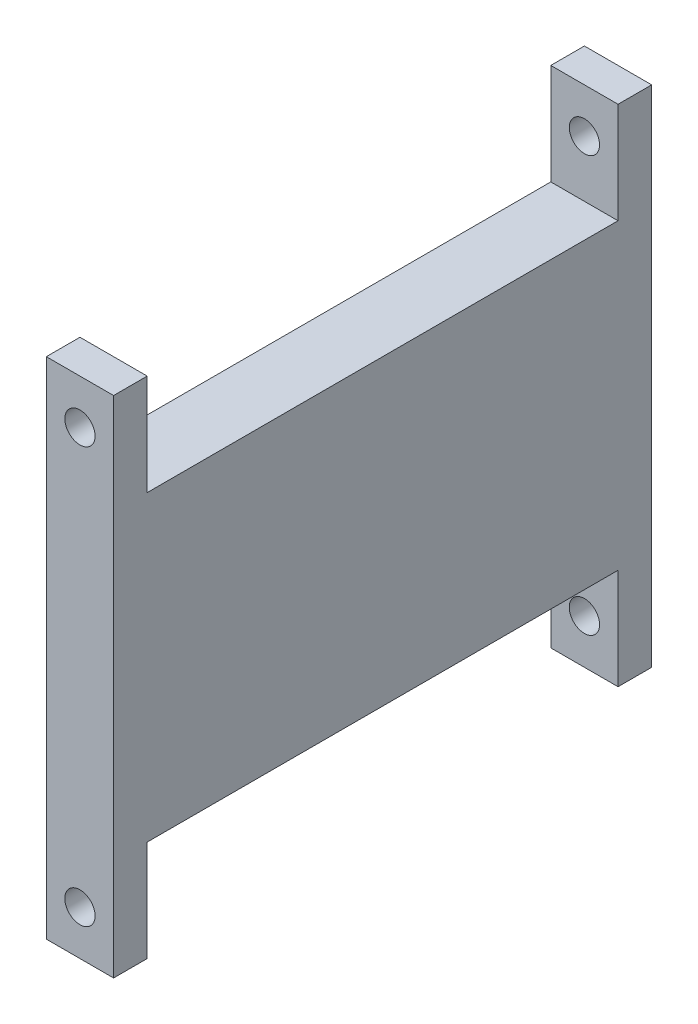
ISO-10303-21;
HEADER;
FILE_DESCRIPTION(('STEP AP214'),'2;1');
FILE_NAME('part.step','',(''),(''),'','','');
FILE_SCHEMA(('AUTOMOTIVE_DESIGN { 1 0 10303 214 1 1 1 1 }'));
ENDSEC;
DATA;
#1=APPLICATION_CONTEXT('core data for automotive mechanical design processes');
#2=APPLICATION_PROTOCOL_DEFINITION('international standard','automotive_design',2000,#1);
#3=PRODUCT_CONTEXT('',#1,'mechanical');
#4=PRODUCT('Part','Part','',(#3));
#5=PRODUCT_RELATED_PRODUCT_CATEGORY('part','',(#4));
#6=PRODUCT_DEFINITION_FORMATION('','',#4);
#7=PRODUCT_DEFINITION_CONTEXT('part definition',#1,'design');
#8=PRODUCT_DEFINITION('design','',#6,#7);
#9=PRODUCT_DEFINITION_SHAPE('','',#8);
#10=(LENGTH_UNIT() NAMED_UNIT(*) SI_UNIT(.MILLI.,.METRE.));
#11=(NAMED_UNIT(*) PLANE_ANGLE_UNIT() SI_UNIT($,.RADIAN.));
#12=(NAMED_UNIT(*) SI_UNIT($,.STERADIAN.) SOLID_ANGLE_UNIT());
#13=UNCERTAINTY_MEASURE_WITH_UNIT(LENGTH_MEASURE(1.E-05),#10,'distance_accuracy_value','');
#14=(GEOMETRIC_REPRESENTATION_CONTEXT(3) GLOBAL_UNCERTAINTY_ASSIGNED_CONTEXT((#13)) GLOBAL_UNIT_ASSIGNED_CONTEXT((#10,
#11,#12)) REPRESENTATION_CONTEXT('',''));
#15=CARTESIAN_POINT('',(0.,0.,0.));
#16=DIRECTION('',(0.,0.,1.));
#17=DIRECTION('',(1.,0.,0.));
#18=AXIS2_PLACEMENT_3D('',#15,#16,#17);
#19=CARTESIAN_POINT('',(-4.,30.,32.));
#20=DIRECTION('',(0.,-1.,0.));
#21=DIRECTION('',(0.,0.,-1.));
#22=AXIS2_PLACEMENT_3D('',#19,#20,#21);
#23=PLANE('',#22);
#24=DIRECTION('',(0.,0.,-1.));
#25=VECTOR('',#24,1.);
#26=CARTESIAN_POINT('',(-4.,30.,32.));
#27=LINE('',#26,#25);
#28=CARTESIAN_POINT('',(-4.,30.,-28.));
#29=VERTEX_POINT('',#28);
#30=CARTESIAN_POINT('',(-4.,30.,-32.));
#31=VERTEX_POINT('',#30);
#32=EDGE_CURVE('E275',#29,#31,#27,.T.);
#33=ORIENTED_EDGE('',*,*,#32,.F.);
#34=DIRECTION('',(-1.,0.,0.));
#35=VECTOR('',#34,1.);
#36=CARTESIAN_POINT('',(26.,30.,-28.));
#37=LINE('',#36,#35);
#38=CARTESIAN_POINT('',(4.,30.,-28.));
#39=VERTEX_POINT('',#38);
#40=EDGE_CURVE('E169',#39,#29,#37,.T.);
#41=ORIENTED_EDGE('',*,*,#40,.F.);
#42=DIRECTION('',(0.,0.,-1.));
#43=VECTOR('',#42,1.);
#44=CARTESIAN_POINT('',(4.,30.,32.));
#45=LINE('',#44,#43);
#46=CARTESIAN_POINT('',(4.,30.,-32.));
#47=VERTEX_POINT('',#46);
#48=EDGE_CURVE('E55',#39,#47,#45,.T.);
#49=ORIENTED_EDGE('',*,*,#48,.T.);
#50=DIRECTION('',(-1.,0.,0.));
#51=VECTOR('',#50,1.);
#52=CARTESIAN_POINT('',(-4.,30.,-32.));
#53=LINE('',#52,#51);
#54=EDGE_CURVE('E255',#47,#31,#53,.T.);
#55=ORIENTED_EDGE('',*,*,#54,.T.);
#56=EDGE_LOOP('',(#33,#41,#49,#55));
#57=FACE_BOUND('',#56,.T.);
#58=ADVANCED_FACE('F45',(#57),#23,.F.);
#59=CARTESIAN_POINT('',(-4.,-30.,32.));
#60=DIRECTION('',(0.,1.,0.));
#61=DIRECTION('',(0.,0.,1.));
#62=AXIS2_PLACEMENT_3D('',#59,#60,#61);
#63=PLANE('',#62);
#64=DIRECTION('',(0.,0.,-1.));
#65=VECTOR('',#64,1.);
#66=CARTESIAN_POINT('',(4.,-30.,32.));
#67=LINE('',#66,#65);
#68=CARTESIAN_POINT('',(4.,-30.,-28.));
#69=VERTEX_POINT('',#68);
#70=CARTESIAN_POINT('',(4.,-30.,-32.));
#71=VERTEX_POINT('',#70);
#72=EDGE_CURVE('E251',#69,#71,#67,.T.);
#73=ORIENTED_EDGE('',*,*,#72,.F.);
#74=DIRECTION('',(-1.,0.,0.));
#75=VECTOR('',#74,1.);
#76=CARTESIAN_POINT('',(26.,-30.,-28.));
#77=LINE('',#76,#75);
#78=CARTESIAN_POINT('',(-4.,-30.,-28.));
#79=VERTEX_POINT('',#78);
#80=EDGE_CURVE('E185',#69,#79,#77,.T.);
#81=ORIENTED_EDGE('',*,*,#80,.T.);
#82=DIRECTION('',(0.,0.,-1.));
#83=VECTOR('',#82,1.);
#84=CARTESIAN_POINT('',(-4.,-30.,32.));
#85=LINE('',#84,#83);
#86=CARTESIAN_POINT('',(-4.,-30.,-32.));
#87=VERTEX_POINT('',#86);
#88=EDGE_CURVE('E270',#79,#87,#85,.T.);
#89=ORIENTED_EDGE('',*,*,#88,.T.);
#90=DIRECTION('',(1.,0.,0.));
#91=VECTOR('',#90,1.);
#92=CARTESIAN_POINT('',(-4.,-30.,-32.));
#93=LINE('',#92,#91);
#94=EDGE_CURVE('E242',#87,#71,#93,.T.);
#95=ORIENTED_EDGE('',*,*,#94,.T.);
#96=EDGE_LOOP('',(#73,#81,#89,#95));
#97=FACE_BOUND('',#96,.T.);
#98=ADVANCED_FACE('F321',(#97),#63,.F.);
#99=CARTESIAN_POINT('',(0.,24.71,32.));
#100=DIRECTION('',(0.,0.,-1.));
#101=DIRECTION('',(-1.,0.,0.));
#102=AXIS2_PLACEMENT_3D('',#99,#100,#101);
#103=CYLINDRICAL_SURFACE('',#102,1.8);
#104=CARTESIAN_POINT('',(0.,24.71,-28.));
#105=DIRECTION('',(0.,0.,-1.));
#106=DIRECTION('',(-1.,0.,0.));
#107=AXIS2_PLACEMENT_3D('',#104,#105,#106);
#108=CIRCLE('',#107,1.8);
#109=CARTESIAN_POINT('',(-1.79999999999999,24.71,-28.));
#110=VERTEX_POINT('',#109);
#111=EDGE_CURVE('E49',#110,#110,#108,.T.);
#112=ORIENTED_EDGE('',*,*,#111,.F.);
#113=EDGE_LOOP('',(#112));
#114=FACE_BOUND('',#113,.T.);
#115=CARTESIAN_POINT('',(0.,24.71,-32.));
#116=DIRECTION('',(0.,0.,1.));
#117=DIRECTION('',(1.,0.,0.));
#118=AXIS2_PLACEMENT_3D('',#115,#116,#117);
#119=CIRCLE('',#118,1.8);
#120=CARTESIAN_POINT('',(1.80000000000001,24.71,-32.));
#121=VERTEX_POINT('',#120);
#122=EDGE_CURVE('E225',#121,#121,#119,.T.);
#123=ORIENTED_EDGE('',*,*,#122,.F.);
#124=EDGE_LOOP('',(#123));
#125=FACE_BOUND('',#124,.T.);
#126=ADVANCED_FACE('F294',(#114,#125),#103,.F.);
#127=CARTESIAN_POINT('',(0.,-24.71,32.));
#128=DIRECTION('',(0.,0.,-1.));
#129=DIRECTION('',(-1.,0.,0.));
#130=AXIS2_PLACEMENT_3D('',#127,#128,#129);
#131=CYLINDRICAL_SURFACE('',#130,1.8);
#132=CARTESIAN_POINT('',(0.,-24.71,-28.));
#133=DIRECTION('',(0.,0.,-1.));
#134=DIRECTION('',(-1.,0.,0.));
#135=AXIS2_PLACEMENT_3D('',#132,#133,#134);
#136=CIRCLE('',#135,1.8);
#137=CARTESIAN_POINT('',(-1.79999999999999,-24.71,-28.));
#138=VERTEX_POINT('',#137);
#139=EDGE_CURVE('E201',#138,#138,#136,.T.);
#140=ORIENTED_EDGE('',*,*,#139,.F.);
#141=EDGE_LOOP('',(#140));
#142=FACE_BOUND('',#141,.T.);
#143=CARTESIAN_POINT('',(0.,-24.71,-32.));
#144=DIRECTION('',(0.,0.,1.));
#145=DIRECTION('',(-1.,0.,0.));
#146=AXIS2_PLACEMENT_3D('',#143,#144,#145);
#147=CIRCLE('',#146,1.8);
#148=CARTESIAN_POINT('',(-1.79999999999999,-24.71,-32.));
#149=VERTEX_POINT('',#148);
#150=EDGE_CURVE('E220',#149,#149,#147,.T.);
#151=ORIENTED_EDGE('',*,*,#150,.F.);
#152=EDGE_LOOP('',(#151));
#153=FACE_BOUND('',#152,.T.);
#154=ADVANCED_FACE('F301',(#142,#153),#131,.F.);
#155=CARTESIAN_POINT('',(0.,0.,32.));
#156=DIRECTION('',(0.,0.,-1.));
#157=DIRECTION('',(-1.,0.,0.));
#158=AXIS2_PLACEMENT_3D('',#155,#156,#157);
#159=PLANE('',#158);
#160=DIRECTION('',(0.,1.,0.));
#161=VECTOR('',#160,1.);
#162=CARTESIAN_POINT('',(4.,-30.,32.));
#163=LINE('',#162,#161);
#164=CARTESIAN_POINT('',(4.,-30.,32.));
#165=VERTEX_POINT('',#164);
#166=CARTESIAN_POINT('',(4.,30.,32.));
#167=VERTEX_POINT('',#166);
#168=EDGE_CURVE('E237',#165,#167,#163,.T.);
#169=ORIENTED_EDGE('',*,*,#168,.T.);
#170=DIRECTION('',(-1.,0.,0.));
#171=VECTOR('',#170,1.);
#172=CARTESIAN_POINT('',(-4.,30.,32.));
#173=LINE('',#172,#171);
#174=CARTESIAN_POINT('',(-4.,30.,32.));
#175=VERTEX_POINT('',#174);
#176=EDGE_CURVE('E241',#167,#175,#173,.T.);
#177=ORIENTED_EDGE('',*,*,#176,.T.);
#178=DIRECTION('',(0.,-1.,0.));
#179=VECTOR('',#178,1.);
#180=CARTESIAN_POINT('',(-4.,-30.,32.));
#181=LINE('',#180,#179);
#182=CARTESIAN_POINT('',(-4.,-30.,32.));
#183=VERTEX_POINT('',#182);
#184=EDGE_CURVE('E245',#175,#183,#181,.T.);
#185=ORIENTED_EDGE('',*,*,#184,.T.);
#186=DIRECTION('',(1.,0.,0.));
#187=VECTOR('',#186,1.);
#188=CARTESIAN_POINT('',(-4.,-30.,32.));
#189=LINE('',#188,#187);
#190=EDGE_CURVE('E248',#183,#165,#189,.T.);
#191=ORIENTED_EDGE('',*,*,#190,.T.);
#192=EDGE_LOOP('',(#169,#177,#185,#191));
#193=FACE_BOUND('',#192,.T.);
#194=CARTESIAN_POINT('',(0.,24.71,32.));
#195=DIRECTION('',(0.,0.,1.));
#196=DIRECTION('',(1.,0.,0.));
#197=AXIS2_PLACEMENT_3D('',#194,#195,#196);
#198=CIRCLE('',#197,1.8);
#199=CARTESIAN_POINT('',(1.80000000000001,24.71,32.));
#200=VERTEX_POINT('',#199);
#201=EDGE_CURVE('E229',#200,#200,#198,.T.);
#202=ORIENTED_EDGE('',*,*,#201,.F.);
#203=EDGE_LOOP('',(#202));
#204=FACE_BOUND('',#203,.T.);
#205=CARTESIAN_POINT('',(0.,-24.71,32.));
#206=DIRECTION('',(0.,0.,1.));
#207=DIRECTION('',(-1.,0.,0.));
#208=AXIS2_PLACEMENT_3D('',#205,#206,#207);
#209=CIRCLE('',#208,1.8);
#210=CARTESIAN_POINT('',(-1.79999999999999,-24.71,32.));
#211=VERTEX_POINT('',#210);
#212=EDGE_CURVE('E221',#211,#211,#209,.T.);
#213=ORIENTED_EDGE('',*,*,#212,.F.);
#214=EDGE_LOOP('',(#213));
#215=FACE_BOUND('',#214,.T.);
#216=ADVANCED_FACE('F297',(#193,#204,#215),#159,.F.);
#217=CARTESIAN_POINT('',(0.,0.,-32.));
#218=DIRECTION('',(0.,0.,-1.));
#219=DIRECTION('',(-1.,0.,0.));
#220=AXIS2_PLACEMENT_3D('',#217,#218,#219);
#221=PLANE('',#220);
#222=ORIENTED_EDGE('',*,*,#122,.T.);
#223=EDGE_LOOP('',(#222));
#224=FACE_BOUND('',#223,.T.);
#225=DIRECTION('',(0.,1.,0.));
#226=VECTOR('',#225,1.);
#227=CARTESIAN_POINT('',(4.,-30.,-32.));
#228=LINE('',#227,#226);
#229=EDGE_CURVE('E233',#71,#47,#228,.T.);
#230=ORIENTED_EDGE('',*,*,#229,.F.);
#231=ORIENTED_EDGE('',*,*,#94,.F.);
#232=DIRECTION('',(0.,-1.,0.));
#233=VECTOR('',#232,1.);
#234=CARTESIAN_POINT('',(-4.,-30.,-32.));
#235=LINE('',#234,#233);
#236=EDGE_CURVE('E259',#31,#87,#235,.T.);
#237=ORIENTED_EDGE('',*,*,#236,.F.);
#238=ORIENTED_EDGE('',*,*,#54,.F.);
#239=EDGE_LOOP('',(#230,#231,#237,#238));
#240=FACE_BOUND('',#239,.T.);
#241=ORIENTED_EDGE('',*,*,#150,.T.);
#242=EDGE_LOOP('',(#241));
#243=FACE_BOUND('',#242,.T.);
#244=ADVANCED_FACE('F300',(#224,#240,#243),#221,.T.);
#245=CARTESIAN_POINT('',(4.,-30.,32.));
#246=DIRECTION('',(-1.,0.,0.));
#247=DIRECTION('',(0.,0.,1.));
#248=AXIS2_PLACEMENT_3D('',#245,#246,#247);
#249=PLANE('',#248);
#250=ORIENTED_EDGE('',*,*,#48,.F.);
#251=DIRECTION('',(0.,-1.,0.));
#252=VECTOR('',#251,1.);
#253=CARTESIAN_POINT('',(4.,-30.,-28.));
#254=LINE('',#253,#252);
#255=CARTESIAN_POINT('',(4.,18.,-28.));
#256=VERTEX_POINT('',#255);
#257=EDGE_CURVE('E209',#39,#256,#254,.T.);
#258=ORIENTED_EDGE('',*,*,#257,.T.);
#259=DIRECTION('',(0.,0.,1.));
#260=VECTOR('',#259,1.);
#261=CARTESIAN_POINT('',(4.,18.,32.));
#262=LINE('',#261,#260);
#263=CARTESIAN_POINT('',(4.,18.,28.));
#264=VERTEX_POINT('',#263);
#265=EDGE_CURVE('E217',#256,#264,#262,.T.);
#266=ORIENTED_EDGE('',*,*,#265,.T.);
#267=DIRECTION('',(0.,1.,0.));
#268=VECTOR('',#267,1.);
#269=CARTESIAN_POINT('',(4.,-30.,28.));
#270=LINE('',#269,#268);
#271=CARTESIAN_POINT('',(4.,30.,28.));
#272=VERTEX_POINT('',#271);
#273=EDGE_CURVE('E145',#264,#272,#270,.T.);
#274=ORIENTED_EDGE('',*,*,#273,.T.);
#275=EDGE_CURVE('E11',#167,#272,#45,.T.);
#276=ORIENTED_EDGE('',*,*,#275,.F.);
#277=ORIENTED_EDGE('',*,*,#168,.F.);
#278=CARTESIAN_POINT('',(4.,-30.,28.));
#279=VERTEX_POINT('',#278);
#280=EDGE_CURVE('E266',#165,#279,#67,.T.);
#281=ORIENTED_EDGE('',*,*,#280,.T.);
#282=DIRECTION('',(0.,1.,0.));
#283=VECTOR('',#282,1.);
#284=CARTESIAN_POINT('',(4.,-30.,28.));
#285=LINE('',#284,#283);
#286=CARTESIAN_POINT('',(4.,-18.,28.));
#287=VERTEX_POINT('',#286);
#288=EDGE_CURVE('E71',#279,#287,#285,.T.);
#289=ORIENTED_EDGE('',*,*,#288,.T.);
#290=DIRECTION('',(0.,0.,-1.));
#291=VECTOR('',#290,1.);
#292=CARTESIAN_POINT('',(4.,-18.,32.));
#293=LINE('',#292,#291);
#294=CARTESIAN_POINT('',(4.,-18.,-28.));
#295=VERTEX_POINT('',#294);
#296=EDGE_CURVE('E213',#287,#295,#293,.T.);
#297=ORIENTED_EDGE('',*,*,#296,.T.);
#298=DIRECTION('',(0.,-1.,0.));
#299=VECTOR('',#298,1.);
#300=CARTESIAN_POINT('',(4.,-30.,-28.));
#301=LINE('',#300,#299);
#302=EDGE_CURVE('E202',#295,#69,#301,.T.);
#303=ORIENTED_EDGE('',*,*,#302,.T.);
#304=ORIENTED_EDGE('',*,*,#72,.T.);
#305=ORIENTED_EDGE('',*,*,#229,.T.);
#306=EDGE_LOOP('',(#250,#258,#266,#274,#276,#277,#281,#289,#297,#303,#304,#305));
#307=FACE_BOUND('',#306,.T.);
#308=ADVANCED_FACE('F47',(#307),#249,.F.);
#309=ORIENTED_EDGE('',*,*,#275,.T.);
#310=DIRECTION('',(-1.,0.,0.));
#311=VECTOR('',#310,1.);
#312=CARTESIAN_POINT('',(26.,30.,28.));
#313=LINE('',#312,#311);
#314=CARTESIAN_POINT('',(-4.,30.,28.));
#315=VERTEX_POINT('',#314);
#316=EDGE_CURVE('E149',#272,#315,#313,.T.);
#317=ORIENTED_EDGE('',*,*,#316,.T.);
#318=EDGE_CURVE('E162',#175,#315,#27,.T.);
#319=ORIENTED_EDGE('',*,*,#318,.F.);
#320=ORIENTED_EDGE('',*,*,#176,.F.);
#321=EDGE_LOOP('',(#309,#317,#319,#320));
#322=FACE_BOUND('',#321,.T.);
#323=ADVANCED_FACE('F323',(#322),#23,.F.);
#324=CARTESIAN_POINT('',(-4.,-30.,32.));
#325=DIRECTION('',(1.,0.,0.));
#326=DIRECTION('',(0.,0.,-1.));
#327=AXIS2_PLACEMENT_3D('',#324,#325,#326);
#328=PLANE('',#327);
#329=DIRECTION('',(0.,0.,1.));
#330=VECTOR('',#329,1.);
#331=CARTESIAN_POINT('',(-4.,18.,-28.));
#332=LINE('',#331,#330);
#333=CARTESIAN_POINT('',(-4.,18.,-28.));
#334=VERTEX_POINT('',#333);
#335=CARTESIAN_POINT('',(-4.,18.,28.));
#336=VERTEX_POINT('',#335);
#337=EDGE_CURVE('E153',#334,#336,#332,.T.);
#338=ORIENTED_EDGE('',*,*,#337,.F.);
#339=DIRECTION('',(0.,-1.,0.));
#340=VECTOR('',#339,1.);
#341=CARTESIAN_POINT('',(-4.,30.,-28.));
#342=LINE('',#341,#340);
#343=EDGE_CURVE('E63',#29,#334,#342,.T.);
#344=ORIENTED_EDGE('',*,*,#343,.F.);
#345=ORIENTED_EDGE('',*,*,#32,.T.);
#346=ORIENTED_EDGE('',*,*,#236,.T.);
#347=ORIENTED_EDGE('',*,*,#88,.F.);
#348=DIRECTION('',(0.,-1.,0.));
#349=VECTOR('',#348,1.);
#350=CARTESIAN_POINT('',(-4.,-30.,-28.));
#351=LINE('',#350,#349);
#352=CARTESIAN_POINT('',(-4.,-18.,-28.));
#353=VERTEX_POINT('',#352);
#354=EDGE_CURVE('E178',#353,#79,#351,.T.);
#355=ORIENTED_EDGE('',*,*,#354,.F.);
#356=DIRECTION('',(0.,0.,-1.));
#357=VECTOR('',#356,1.);
#358=CARTESIAN_POINT('',(-4.,-18.,-28.));
#359=LINE('',#358,#357);
#360=CARTESIAN_POINT('',(-4.,-18.,28.));
#361=VERTEX_POINT('',#360);
#362=EDGE_CURVE('E191',#361,#353,#359,.T.);
#363=ORIENTED_EDGE('',*,*,#362,.F.);
#364=DIRECTION('',(0.,1.,0.));
#365=VECTOR('',#364,1.);
#366=CARTESIAN_POINT('',(-4.,-30.,28.));
#367=LINE('',#366,#365);
#368=CARTESIAN_POINT('',(-4.,-30.,28.));
#369=VERTEX_POINT('',#368);
#370=EDGE_CURVE('E195',#369,#361,#367,.T.);
#371=ORIENTED_EDGE('',*,*,#370,.F.);
#372=EDGE_CURVE('E271',#183,#369,#85,.T.);
#373=ORIENTED_EDGE('',*,*,#372,.F.);
#374=ORIENTED_EDGE('',*,*,#184,.F.);
#375=ORIENTED_EDGE('',*,*,#318,.T.);
#376=DIRECTION('',(0.,1.,0.));
#377=VECTOR('',#376,1.);
#378=CARTESIAN_POINT('',(-4.,30.,28.));
#379=LINE('',#378,#377);
#380=EDGE_CURVE('E142',#336,#315,#379,.T.);
#381=ORIENTED_EDGE('',*,*,#380,.F.);
#382=EDGE_LOOP('',(#338,#344,#345,#346,#347,#355,#363,#371,#373,#374,#375,#381));
#383=FACE_BOUND('',#382,.T.);
#384=ADVANCED_FACE('F159',(#383),#328,.F.);
#385=ORIENTED_EDGE('',*,*,#372,.T.);
#386=DIRECTION('',(-1.,0.,0.));
#387=VECTOR('',#386,1.);
#388=CARTESIAN_POINT('',(26.,-30.,28.));
#389=LINE('',#388,#387);
#390=EDGE_CURVE('E175',#279,#369,#389,.T.);
#391=ORIENTED_EDGE('',*,*,#390,.F.);
#392=ORIENTED_EDGE('',*,*,#280,.F.);
#393=ORIENTED_EDGE('',*,*,#190,.F.);
#394=EDGE_LOOP('',(#385,#391,#392,#393));
#395=FACE_BOUND('',#394,.T.);
#396=ADVANCED_FACE('F292',(#395),#63,.F.);
#397=CARTESIAN_POINT('',(0.,24.71,28.));
#398=DIRECTION('',(0.,0.,1.));
#399=DIRECTION('',(1.,0.,0.));
#400=AXIS2_PLACEMENT_3D('',#397,#398,#399);
#401=CIRCLE('',#400,1.8);
#402=CARTESIAN_POINT('',(1.80000000000001,24.71,28.));
#403=VERTEX_POINT('',#402);
#404=EDGE_CURVE('E206',#403,#403,#401,.T.);
#405=ORIENTED_EDGE('',*,*,#404,.F.);
#406=EDGE_LOOP('',(#405));
#407=FACE_BOUND('',#406,.T.);
#408=ORIENTED_EDGE('',*,*,#201,.T.);
#409=EDGE_LOOP('',(#408));
#410=FACE_BOUND('',#409,.T.);
#411=ADVANCED_FACE('F288',(#407,#410),#103,.F.);
#412=CARTESIAN_POINT('',(0.,-24.71,28.));
#413=DIRECTION('',(0.,0.,1.));
#414=DIRECTION('',(1.,0.,0.));
#415=AXIS2_PLACEMENT_3D('',#412,#413,#414);
#416=CIRCLE('',#415,1.8);
#417=CARTESIAN_POINT('',(1.80000000000001,-24.71,28.));
#418=VERTEX_POINT('',#417);
#419=EDGE_CURVE('E172',#418,#418,#416,.T.);
#420=ORIENTED_EDGE('',*,*,#419,.F.);
#421=EDGE_LOOP('',(#420));
#422=FACE_BOUND('',#421,.T.);
#423=ORIENTED_EDGE('',*,*,#212,.T.);
#424=EDGE_LOOP('',(#423));
#425=FACE_BOUND('',#424,.T.);
#426=ADVANCED_FACE('F291',(#422,#425),#131,.F.);
#427=CARTESIAN_POINT('',(26.,-18.,-28.));
#428=DIRECTION('',(0.,1.,0.));
#429=DIRECTION('',(0.,0.,1.));
#430=AXIS2_PLACEMENT_3D('',#427,#428,#429);
#431=PLANE('',#430);
#432=DIRECTION('',(-1.,0.,0.));
#433=VECTOR('',#432,1.);
#434=CARTESIAN_POINT('',(26.,-18.,28.));
#435=LINE('',#434,#433);
#436=EDGE_CURVE('E179',#287,#361,#435,.T.);
#437=ORIENTED_EDGE('',*,*,#436,.T.);
#438=ORIENTED_EDGE('',*,*,#362,.T.);
#439=DIRECTION('',(-1.,0.,0.));
#440=VECTOR('',#439,1.);
#441=CARTESIAN_POINT('',(26.,-18.,-28.));
#442=LINE('',#441,#440);
#443=EDGE_CURVE('E182',#295,#353,#442,.T.);
#444=ORIENTED_EDGE('',*,*,#443,.F.);
#445=ORIENTED_EDGE('',*,*,#296,.F.);
#446=EDGE_LOOP('',(#437,#438,#444,#445));
#447=FACE_BOUND('',#446,.T.);
#448=ADVANCED_FACE('F307',(#447),#431,.F.);
#449=CARTESIAN_POINT('',(26.,-30.,-28.));
#450=DIRECTION('',(0.,0.,-1.));
#451=DIRECTION('',(-1.,0.,0.));
#452=AXIS2_PLACEMENT_3D('',#449,#450,#451);
#453=PLANE('',#452);
#454=ORIENTED_EDGE('',*,*,#139,.T.);
#455=EDGE_LOOP('',(#454));
#456=FACE_BOUND('',#455,.T.);
#457=ORIENTED_EDGE('',*,*,#443,.T.);
#458=ORIENTED_EDGE('',*,*,#354,.T.);
#459=ORIENTED_EDGE('',*,*,#80,.F.);
#460=ORIENTED_EDGE('',*,*,#302,.F.);
#461=EDGE_LOOP('',(#457,#458,#459,#460));
#462=FACE_BOUND('',#461,.T.);
#463=ADVANCED_FACE('F313',(#456,#462),#453,.F.);
#464=CARTESIAN_POINT('',(26.,-30.,28.));
#465=DIRECTION('',(0.,0.,1.));
#466=DIRECTION('',(1.,0.,0.));
#467=AXIS2_PLACEMENT_3D('',#464,#465,#466);
#468=PLANE('',#467);
#469=ORIENTED_EDGE('',*,*,#419,.T.);
#470=EDGE_LOOP('',(#469));
#471=FACE_BOUND('',#470,.T.);
#472=ORIENTED_EDGE('',*,*,#390,.T.);
#473=ORIENTED_EDGE('',*,*,#370,.T.);
#474=ORIENTED_EDGE('',*,*,#436,.F.);
#475=ORIENTED_EDGE('',*,*,#288,.F.);
#476=EDGE_LOOP('',(#472,#473,#474,#475));
#477=FACE_BOUND('',#476,.T.);
#478=ADVANCED_FACE('F373',(#471,#477),#468,.F.);
#479=CARTESIAN_POINT('',(26.,18.,-28.));
#480=DIRECTION('',(0.,-1.,0.));
#481=DIRECTION('',(0.,0.,-1.));
#482=AXIS2_PLACEMENT_3D('',#479,#480,#481);
#483=PLANE('',#482);
#484=DIRECTION('',(-1.,0.,0.));
#485=VECTOR('',#484,1.);
#486=CARTESIAN_POINT('',(26.,18.,-28.));
#487=LINE('',#486,#485);
#488=EDGE_CURVE('E150',#256,#334,#487,.T.);
#489=ORIENTED_EDGE('',*,*,#488,.T.);
#490=ORIENTED_EDGE('',*,*,#337,.T.);
#491=DIRECTION('',(-1.,0.,0.));
#492=VECTOR('',#491,1.);
#493=CARTESIAN_POINT('',(26.,18.,28.));
#494=LINE('',#493,#492);
#495=EDGE_CURVE('E138',#264,#336,#494,.T.);
#496=ORIENTED_EDGE('',*,*,#495,.F.);
#497=ORIENTED_EDGE('',*,*,#265,.F.);
#498=EDGE_LOOP('',(#489,#490,#496,#497));
#499=FACE_BOUND('',#498,.T.);
#500=ADVANCED_FACE('F154',(#499),#483,.F.);
#501=CARTESIAN_POINT('',(26.,30.,-28.));
#502=DIRECTION('',(0.,0.,-1.));
#503=DIRECTION('',(-1.,0.,0.));
#504=AXIS2_PLACEMENT_3D('',#501,#502,#503);
#505=PLANE('',#504);
#506=ORIENTED_EDGE('',*,*,#111,.T.);
#507=EDGE_LOOP('',(#506));
#508=FACE_BOUND('',#507,.T.);
#509=ORIENTED_EDGE('',*,*,#40,.T.);
#510=ORIENTED_EDGE('',*,*,#343,.T.);
#511=ORIENTED_EDGE('',*,*,#488,.F.);
#512=ORIENTED_EDGE('',*,*,#257,.F.);
#513=EDGE_LOOP('',(#509,#510,#511,#512));
#514=FACE_BOUND('',#513,.T.);
#515=ADVANCED_FACE('F342',(#508,#514),#505,.F.);
#516=CARTESIAN_POINT('',(26.,30.,28.));
#517=DIRECTION('',(0.,0.,1.));
#518=DIRECTION('',(1.,0.,0.));
#519=AXIS2_PLACEMENT_3D('',#516,#517,#518);
#520=PLANE('',#519);
#521=ORIENTED_EDGE('',*,*,#404,.T.);
#522=EDGE_LOOP('',(#521));
#523=FACE_BOUND('',#522,.T.);
#524=ORIENTED_EDGE('',*,*,#495,.T.);
#525=ORIENTED_EDGE('',*,*,#380,.T.);
#526=ORIENTED_EDGE('',*,*,#316,.F.);
#527=ORIENTED_EDGE('',*,*,#273,.F.);
#528=EDGE_LOOP('',(#524,#525,#526,#527));
#529=FACE_BOUND('',#528,.T.);
#530=ADVANCED_FACE('F140',(#523,#529),#520,.F.);
#531=CLOSED_SHELL('',(#58,#98,#126,#154,#216,#244,#308,#323,#384,#396,#411,#426,#448,#463,#478,
#500,#515,#530));
#532=MANIFOLD_SOLID_BREP('B2',#531);
#533=ADVANCED_BREP_SHAPE_REPRESENTATION('',(#18,#532),#14);
#534=SHAPE_DEFINITION_REPRESENTATION(#9,#533);
ENDSEC;
END-ISO-10303-21;
